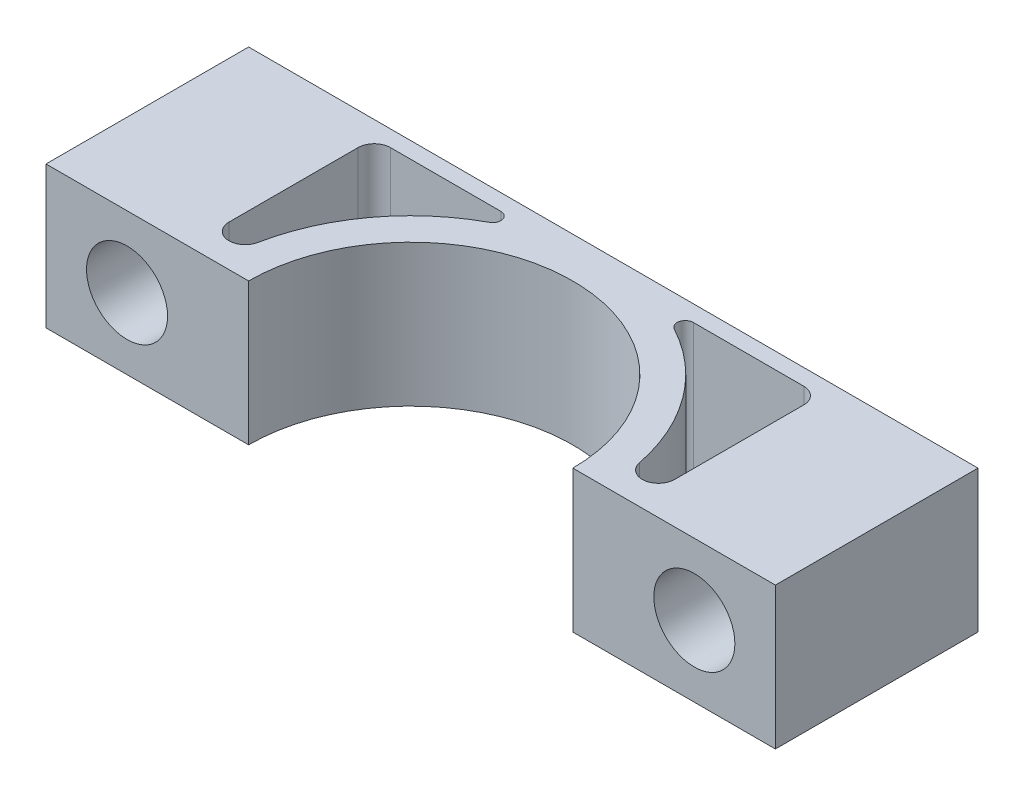
ISO-10303-21;
HEADER;
FILE_DESCRIPTION(('STEP AP214'),'2;1');
FILE_NAME('part.step','',(''),(''),'','','');
FILE_SCHEMA(('AUTOMOTIVE_DESIGN { 1 0 10303 214 1 1 1 1 }'));
ENDSEC;
DATA;
#1=APPLICATION_CONTEXT('core data for automotive mechanical design processes');
#2=APPLICATION_PROTOCOL_DEFINITION('international standard','automotive_design',2000,#1);
#3=PRODUCT_CONTEXT('',#1,'mechanical');
#4=PRODUCT('Part','Part','',(#3));
#5=PRODUCT_RELATED_PRODUCT_CATEGORY('part','',(#4));
#6=PRODUCT_DEFINITION_FORMATION('','',#4);
#7=PRODUCT_DEFINITION_CONTEXT('part definition',#1,'design');
#8=PRODUCT_DEFINITION('design','',#6,#7);
#9=PRODUCT_DEFINITION_SHAPE('','',#8);
#10=(LENGTH_UNIT() NAMED_UNIT(*) SI_UNIT(.MILLI.,.METRE.));
#11=(NAMED_UNIT(*) PLANE_ANGLE_UNIT() SI_UNIT($,.RADIAN.));
#12=(NAMED_UNIT(*) SI_UNIT($,.STERADIAN.) SOLID_ANGLE_UNIT());
#13=UNCERTAINTY_MEASURE_WITH_UNIT(LENGTH_MEASURE(1.E-05),#10,'distance_accuracy_value','');
#14=(GEOMETRIC_REPRESENTATION_CONTEXT(3) GLOBAL_UNCERTAINTY_ASSIGNED_CONTEXT((#13)) GLOBAL_UNIT_ASSIGNED_CONTEXT((#10,
#11,#12)) REPRESENTATION_CONTEXT('',''));
#15=CARTESIAN_POINT('',(0.,0.,0.));
#16=DIRECTION('',(0.,0.,1.));
#17=DIRECTION('',(1.,0.,0.));
#18=AXIS2_PLACEMENT_3D('',#15,#16,#17);
#19=CARTESIAN_POINT('',(0.,5.5626,0.));
#20=DIRECTION('',(0.,-1.,0.));
#21=DIRECTION('',(0.,0.,-1.));
#22=AXIS2_PLACEMENT_3D('',#19,#20,#21);
#23=PLANE('',#22);
#24=CARTESIAN_POINT('',(-16.1925,5.5626,-3.22227307191679));
#25=DIRECTION('',(0.,1.,0.));
#26=DIRECTION('',(0.,0.,1.));
#27=AXIS2_PLACEMENT_3D('',#24,#25,#26);
#28=CIRCLE('',#27,1.27);
#29=CARTESIAN_POINT('',(-17.4625,5.5626,-3.22227307191679));
#30=VERTEX_POINT('',#29);
#31=CARTESIAN_POINT('',(-14.9469230769231,5.5626,-2.97440591253857));
#32=VERTEX_POINT('',#31);
#33=EDGE_CURVE('E226',#30,#32,#28,.T.);
#34=ORIENTED_EDGE('',*,*,#33,.F.);
#35=DIRECTION('',(0.,0.,1.));
#36=VECTOR('',#35,1.);
#37=CARTESIAN_POINT('',(-17.4625,5.5626,-3.22227307191679));
#38=LINE('',#37,#36);
#39=CARTESIAN_POINT('',(-17.4625,5.5626,-13.335));
#40=VERTEX_POINT('',#39);
#41=EDGE_CURVE('E239',#40,#30,#38,.T.);
#42=ORIENTED_EDGE('',*,*,#41,.F.);
#43=CARTESIAN_POINT('',(-16.1925,5.5626,-13.335));
#44=DIRECTION('',(0.,1.,0.));
#45=DIRECTION('',(0.,0.,1.));
#46=AXIS2_PLACEMENT_3D('',#43,#44,#45);
#47=CIRCLE('',#46,1.27);
#48=CARTESIAN_POINT('',(-16.1925,5.5626,-14.605));
#49=VERTEX_POINT('',#48);
#50=EDGE_CURVE('E243',#49,#40,#47,.T.);
#51=ORIENTED_EDGE('',*,*,#50,.F.);
#52=DIRECTION('',(-1.,0.,0.));
#53=VECTOR('',#52,1.);
#54=CARTESIAN_POINT('',(-16.1925,5.5626,-14.605));
#55=LINE('',#54,#53);
#56=CARTESIAN_POINT('',(-7.54020722526908,5.5626,-14.605));
#57=VERTEX_POINT('',#56);
#58=EDGE_CURVE('E593',#57,#49,#55,.T.);
#59=ORIENTED_EDGE('',*,*,#58,.F.);
#60=CARTESIAN_POINT('',(-7.54020722526908,5.5626,-13.97));
#61=DIRECTION('',(0.,1.,0.));
#62=DIRECTION('',(0.,0.,1.));
#63=AXIS2_PLACEMENT_3D('',#60,#61,#62);
#64=CIRCLE('',#63,0.635);
#65=CARTESIAN_POINT('',(-7.23859893625831,5.5626,-13.4112));
#66=VERTEX_POINT('',#65);
#67=EDGE_CURVE('E600',#66,#57,#64,.T.);
#68=ORIENTED_EDGE('',*,*,#67,.F.);
#69=CARTESIAN_POINT('',(0.,5.5626,0.));
#70=DIRECTION('',(0.,-1.,0.));
#71=DIRECTION('',(0.,0.,-1.));
#72=AXIS2_PLACEMENT_3D('',#69,#70,#71);
#73=CIRCLE('',#72,15.24);
#74=EDGE_CURVE('E229',#32,#66,#73,.T.);
#75=ORIENTED_EDGE('',*,*,#74,.F.);
#76=EDGE_LOOP('',(#34,#42,#51,#59,#68,#75));
#77=FACE_BOUND('',#76,.T.);
#78=CARTESIAN_POINT('',(0.,5.5626,0.));
#79=DIRECTION('',(0.,-1.,0.));
#80=DIRECTION('',(0.,0.,-1.));
#81=AXIS2_PLACEMENT_3D('',#78,#79,#80);
#82=CIRCLE('',#81,12.7);
#83=CARTESIAN_POINT('',(-12.7,5.5626,0.));
#84=VERTEX_POINT('',#83);
#85=CARTESIAN_POINT('',(12.7,5.5626,0.));
#86=VERTEX_POINT('',#85);
#87=EDGE_CURVE('E276',#84,#86,#82,.T.);
#88=ORIENTED_EDGE('',*,*,#87,.T.);
#89=DIRECTION('',(1.,0.,0.));
#90=VECTOR('',#89,1.);
#91=CARTESIAN_POINT('',(28.575,5.5626,0.));
#92=LINE('',#91,#90);
#93=CARTESIAN_POINT('',(28.575,5.5626,0.));
#94=VERTEX_POINT('',#93);
#95=EDGE_CURVE('E280',#86,#94,#92,.T.);
#96=ORIENTED_EDGE('',*,*,#95,.T.);
#97=DIRECTION('',(0.,0.,-1.));
#98=VECTOR('',#97,1.);
#99=CARTESIAN_POINT('',(28.575,5.5626,-15.875));
#100=LINE('',#99,#98);
#101=CARTESIAN_POINT('',(28.575,5.5626,-15.875));
#102=VERTEX_POINT('',#101);
#103=EDGE_CURVE('E292',#94,#102,#100,.T.);
#104=ORIENTED_EDGE('',*,*,#103,.T.);
#105=DIRECTION('',(-1.,0.,0.));
#106=VECTOR('',#105,1.);
#107=CARTESIAN_POINT('',(-28.575,5.5626,-15.875));
#108=LINE('',#107,#106);
#109=CARTESIAN_POINT('',(-28.575,5.5626,-15.875));
#110=VERTEX_POINT('',#109);
#111=EDGE_CURVE('E294',#102,#110,#108,.T.);
#112=ORIENTED_EDGE('',*,*,#111,.T.);
#113=DIRECTION('',(0.,0.,1.));
#114=VECTOR('',#113,1.);
#115=CARTESIAN_POINT('',(-28.575,5.5626,0.));
#116=LINE('',#115,#114);
#117=CARTESIAN_POINT('',(-28.575,5.5626,0.));
#118=VERTEX_POINT('',#117);
#119=EDGE_CURVE('E297',#110,#118,#116,.T.);
#120=ORIENTED_EDGE('',*,*,#119,.T.);
#121=DIRECTION('',(1.,0.,0.));
#122=VECTOR('',#121,1.);
#123=CARTESIAN_POINT('',(-12.7,5.5626,0.));
#124=LINE('',#123,#122);
#125=EDGE_CURVE('E300',#118,#84,#124,.T.);
#126=ORIENTED_EDGE('',*,*,#125,.T.);
#127=EDGE_LOOP('',(#88,#96,#104,#112,#120,#126));
#128=FACE_BOUND('',#127,.T.);
#129=CARTESIAN_POINT('',(16.1925,5.5626,-13.335));
#130=DIRECTION('',(0.,1.,0.));
#131=DIRECTION('',(0.,0.,-1.));
#132=AXIS2_PLACEMENT_3D('',#129,#130,#131);
#133=CIRCLE('',#132,1.27);
#134=CARTESIAN_POINT('',(17.4625,5.5626,-13.335));
#135=VERTEX_POINT('',#134);
#136=CARTESIAN_POINT('',(16.1925,5.5626,-14.605));
#137=VERTEX_POINT('',#136);
#138=EDGE_CURVE('E164',#135,#137,#133,.T.);
#139=ORIENTED_EDGE('',*,*,#138,.F.);
#140=DIRECTION('',(0.,0.,-1.));
#141=VECTOR('',#140,1.);
#142=CARTESIAN_POINT('',(17.4625,5.5626,-3.22227307191679));
#143=LINE('',#142,#141);
#144=CARTESIAN_POINT('',(17.4625,5.5626,-3.22227307191679));
#145=VERTEX_POINT('',#144);
#146=EDGE_CURVE('E202',#145,#135,#143,.T.);
#147=ORIENTED_EDGE('',*,*,#146,.F.);
#148=CARTESIAN_POINT('',(16.1925,5.5626,-3.22227307191679));
#149=DIRECTION('',(0.,1.,0.));
#150=DIRECTION('',(0.,0.,-1.));
#151=AXIS2_PLACEMENT_3D('',#148,#149,#150);
#152=CIRCLE('',#151,1.27);
#153=CARTESIAN_POINT('',(14.9469230769231,5.5626,-2.97440591253858));
#154=VERTEX_POINT('',#153);
#155=EDGE_CURVE('E200',#154,#145,#152,.T.);
#156=ORIENTED_EDGE('',*,*,#155,.F.);
#157=CARTESIAN_POINT('',(0.,5.5626,0.));
#158=DIRECTION('',(0.,-1.,0.));
#159=DIRECTION('',(0.,0.,1.));
#160=AXIS2_PLACEMENT_3D('',#157,#158,#159);
#161=CIRCLE('',#160,15.24);
#162=CARTESIAN_POINT('',(7.23859893625831,5.5626,-13.4112));
#163=VERTEX_POINT('',#162);
#164=EDGE_CURVE('E186',#163,#154,#161,.T.);
#165=ORIENTED_EDGE('',*,*,#164,.F.);
#166=CARTESIAN_POINT('',(7.54020722526908,5.5626,-13.97));
#167=DIRECTION('',(0.,1.,0.));
#168=DIRECTION('',(0.,0.,-1.));
#169=AXIS2_PLACEMENT_3D('',#166,#167,#168);
#170=CIRCLE('',#169,0.635);
#171=CARTESIAN_POINT('',(7.54020722526908,5.5626,-14.605));
#172=VERTEX_POINT('',#171);
#173=EDGE_CURVE('E185',#172,#163,#170,.T.);
#174=ORIENTED_EDGE('',*,*,#173,.F.);
#175=DIRECTION('',(-1.,0.,0.));
#176=VECTOR('',#175,1.);
#177=CARTESIAN_POINT('',(16.1925,5.5626,-14.605));
#178=LINE('',#177,#176);
#179=EDGE_CURVE('E172',#137,#172,#178,.T.);
#180=ORIENTED_EDGE('',*,*,#179,.F.);
#181=EDGE_LOOP('',(#139,#147,#156,#165,#174,#180));
#182=FACE_BOUND('',#181,.T.);
#183=ADVANCED_FACE('F39',(#77,#128,#182),#23,.F.);
#184=CARTESIAN_POINT('',(0.,-5.5626,0.));
#185=DIRECTION('',(0.,-1.,0.));
#186=DIRECTION('',(0.,0.,-1.));
#187=AXIS2_PLACEMENT_3D('',#184,#185,#186);
#188=PLANE('',#187);
#189=CARTESIAN_POINT('',(0.,-5.5626,0.));
#190=DIRECTION('',(0.,-1.,0.));
#191=DIRECTION('',(0.,0.,-1.));
#192=AXIS2_PLACEMENT_3D('',#189,#190,#191);
#193=CIRCLE('',#192,12.7);
#194=CARTESIAN_POINT('',(-12.7,-5.5626,0.));
#195=VERTEX_POINT('',#194);
#196=CARTESIAN_POINT('',(12.7,-5.5626,0.));
#197=VERTEX_POINT('',#196);
#198=EDGE_CURVE('E275',#195,#197,#193,.T.);
#199=ORIENTED_EDGE('',*,*,#198,.F.);
#200=DIRECTION('',(1.,0.,0.));
#201=VECTOR('',#200,1.);
#202=CARTESIAN_POINT('',(-12.7,-5.5626,0.));
#203=LINE('',#202,#201);
#204=CARTESIAN_POINT('',(-28.575,-5.5626,0.));
#205=VERTEX_POINT('',#204);
#206=EDGE_CURVE('E281',#205,#195,#203,.T.);
#207=ORIENTED_EDGE('',*,*,#206,.F.);
#208=DIRECTION('',(0.,0.,1.));
#209=VECTOR('',#208,1.);
#210=CARTESIAN_POINT('',(-28.575,-5.5626,0.));
#211=LINE('',#210,#209);
#212=CARTESIAN_POINT('',(-28.575,-5.5626,-15.875));
#213=VERTEX_POINT('',#212);
#214=EDGE_CURVE('E313',#213,#205,#211,.T.);
#215=ORIENTED_EDGE('',*,*,#214,.F.);
#216=DIRECTION('',(-1.,0.,0.));
#217=VECTOR('',#216,1.);
#218=CARTESIAN_POINT('',(-28.575,-5.5626,-15.875));
#219=LINE('',#218,#217);
#220=CARTESIAN_POINT('',(28.575,-5.5626,-15.875));
#221=VERTEX_POINT('',#220);
#222=EDGE_CURVE('E311',#221,#213,#219,.T.);
#223=ORIENTED_EDGE('',*,*,#222,.F.);
#224=DIRECTION('',(0.,0.,-1.));
#225=VECTOR('',#224,1.);
#226=CARTESIAN_POINT('',(28.575,-5.5626,-15.875));
#227=LINE('',#226,#225);
#228=CARTESIAN_POINT('',(28.575,-5.5626,0.));
#229=VERTEX_POINT('',#228);
#230=EDGE_CURVE('E309',#229,#221,#227,.T.);
#231=ORIENTED_EDGE('',*,*,#230,.F.);
#232=DIRECTION('',(1.,0.,0.));
#233=VECTOR('',#232,1.);
#234=CARTESIAN_POINT('',(28.575,-5.5626,0.));
#235=LINE('',#234,#233);
#236=EDGE_CURVE('E307',#197,#229,#235,.T.);
#237=ORIENTED_EDGE('',*,*,#236,.F.);
#238=EDGE_LOOP('',(#199,#207,#215,#223,#231,#237));
#239=FACE_BOUND('',#238,.T.);
#240=DIRECTION('',(0.,0.,1.));
#241=VECTOR('',#240,1.);
#242=CARTESIAN_POINT('',(-17.4625,-5.5626,-3.22227307191679));
#243=LINE('',#242,#241);
#244=CARTESIAN_POINT('',(-17.4625,-5.5626,-13.335));
#245=VERTEX_POINT('',#244);
#246=CARTESIAN_POINT('',(-17.4625,-5.5626,-3.22227307191679));
#247=VERTEX_POINT('',#246);
#248=EDGE_CURVE('E230',#245,#247,#243,.T.);
#249=ORIENTED_EDGE('',*,*,#248,.T.);
#250=CARTESIAN_POINT('',(-16.1925,-5.5626,-3.22227307191679));
#251=DIRECTION('',(0.,1.,0.));
#252=DIRECTION('',(0.,0.,1.));
#253=AXIS2_PLACEMENT_3D('',#250,#251,#252);
#254=CIRCLE('',#253,1.27);
#255=CARTESIAN_POINT('',(-14.9469230769231,-5.5626,-2.97440591253857));
#256=VERTEX_POINT('',#255);
#257=EDGE_CURVE('E180',#247,#256,#254,.T.);
#258=ORIENTED_EDGE('',*,*,#257,.T.);
#259=CARTESIAN_POINT('',(0.,-5.5626,0.));
#260=DIRECTION('',(0.,-1.,0.));
#261=DIRECTION('',(0.,0.,-1.));
#262=AXIS2_PLACEMENT_3D('',#259,#260,#261);
#263=CIRCLE('',#262,15.24);
#264=CARTESIAN_POINT('',(-7.23859893625831,-5.5626,-13.4112));
#265=VERTEX_POINT('',#264);
#266=EDGE_CURVE('E248',#256,#265,#263,.T.);
#267=ORIENTED_EDGE('',*,*,#266,.T.);
#268=CARTESIAN_POINT('',(-7.54020722526908,-5.5626,-13.97));
#269=DIRECTION('',(0.,1.,0.));
#270=DIRECTION('',(0.,0.,1.));
#271=AXIS2_PLACEMENT_3D('',#268,#269,#270);
#272=CIRCLE('',#271,0.635);
#273=CARTESIAN_POINT('',(-7.54020722526908,-5.5626,-14.605));
#274=VERTEX_POINT('',#273);
#275=EDGE_CURVE('E251',#265,#274,#272,.T.);
#276=ORIENTED_EDGE('',*,*,#275,.T.);
#277=DIRECTION('',(-1.,0.,0.));
#278=VECTOR('',#277,1.);
#279=CARTESIAN_POINT('',(-16.1925,-5.5626,-14.605));
#280=LINE('',#279,#278);
#281=CARTESIAN_POINT('',(-16.1925,-5.5626,-14.605));
#282=VERTEX_POINT('',#281);
#283=EDGE_CURVE('E254',#274,#282,#280,.T.);
#284=ORIENTED_EDGE('',*,*,#283,.T.);
#285=CARTESIAN_POINT('',(-16.1925,-5.5626,-13.335));
#286=DIRECTION('',(0.,1.,0.));
#287=DIRECTION('',(0.,0.,1.));
#288=AXIS2_PLACEMENT_3D('',#285,#286,#287);
#289=CIRCLE('',#288,1.27);
#290=EDGE_CURVE('E257',#282,#245,#289,.T.);
#291=ORIENTED_EDGE('',*,*,#290,.T.);
#292=EDGE_LOOP('',(#249,#258,#267,#276,#284,#291));
#293=FACE_BOUND('',#292,.T.);
#294=DIRECTION('',(0.,0.,-1.));
#295=VECTOR('',#294,1.);
#296=CARTESIAN_POINT('',(17.4625,-5.5626,-3.22227307191679));
#297=LINE('',#296,#295);
#298=CARTESIAN_POINT('',(17.4625,-5.5626,-3.22227307191679));
#299=VERTEX_POINT('',#298);
#300=CARTESIAN_POINT('',(17.4625,-5.5626,-13.335));
#301=VERTEX_POINT('',#300);
#302=EDGE_CURVE('E173',#299,#301,#297,.T.);
#303=ORIENTED_EDGE('',*,*,#302,.T.);
#304=CARTESIAN_POINT('',(16.1925,-5.5626,-13.335));
#305=DIRECTION('',(0.,1.,0.));
#306=DIRECTION('',(0.,0.,-1.));
#307=AXIS2_PLACEMENT_3D('',#304,#305,#306);
#308=CIRCLE('',#307,1.27);
#309=CARTESIAN_POINT('',(16.1925,-5.5626,-14.605));
#310=VERTEX_POINT('',#309);
#311=EDGE_CURVE('E62',#301,#310,#308,.T.);
#312=ORIENTED_EDGE('',*,*,#311,.T.);
#313=DIRECTION('',(-1.,0.,0.));
#314=VECTOR('',#313,1.);
#315=CARTESIAN_POINT('',(16.1925,-5.5626,-14.605));
#316=LINE('',#315,#314);
#317=CARTESIAN_POINT('',(7.54020722526908,-5.5626,-14.605));
#318=VERTEX_POINT('',#317);
#319=EDGE_CURVE('E179',#310,#318,#316,.T.);
#320=ORIENTED_EDGE('',*,*,#319,.T.);
#321=CARTESIAN_POINT('',(7.54020722526908,-5.5626,-13.97));
#322=DIRECTION('',(0.,1.,0.));
#323=DIRECTION('',(0.,0.,-1.));
#324=AXIS2_PLACEMENT_3D('',#321,#322,#323);
#325=CIRCLE('',#324,0.635);
#326=CARTESIAN_POINT('',(7.23859893625831,-5.5626,-13.4112));
#327=VERTEX_POINT('',#326);
#328=EDGE_CURVE('E208',#318,#327,#325,.T.);
#329=ORIENTED_EDGE('',*,*,#328,.T.);
#330=CARTESIAN_POINT('',(0.,-5.5626,0.));
#331=DIRECTION('',(0.,-1.,0.));
#332=DIRECTION('',(0.,0.,1.));
#333=AXIS2_PLACEMENT_3D('',#330,#331,#332);
#334=CIRCLE('',#333,15.24);
#335=CARTESIAN_POINT('',(14.9469230769231,-5.5626,-2.97440591253858));
#336=VERTEX_POINT('',#335);
#337=EDGE_CURVE('E211',#327,#336,#334,.T.);
#338=ORIENTED_EDGE('',*,*,#337,.T.);
#339=CARTESIAN_POINT('',(16.1925,-5.5626,-3.22227307191679));
#340=DIRECTION('',(0.,1.,0.));
#341=DIRECTION('',(0.,0.,-1.));
#342=AXIS2_PLACEMENT_3D('',#339,#340,#341);
#343=CIRCLE('',#342,1.27);
#344=EDGE_CURVE('E214',#336,#299,#343,.T.);
#345=ORIENTED_EDGE('',*,*,#344,.T.);
#346=EDGE_LOOP('',(#303,#312,#320,#329,#338,#345));
#347=FACE_BOUND('',#346,.T.);
#348=ADVANCED_FACE('F337',(#239,#293,#347),#188,.T.);
#349=CARTESIAN_POINT('',(0.,5.5626,0.));
#350=DIRECTION('',(0.,-1.,0.));
#351=DIRECTION('',(0.,0.,-1.));
#352=AXIS2_PLACEMENT_3D('',#349,#350,#351);
#353=CYLINDRICAL_SURFACE('',#352,12.7);
#354=ORIENTED_EDGE('',*,*,#198,.T.);
#355=DIRECTION('',(0.,-1.,0.));
#356=VECTOR('',#355,1.);
#357=CARTESIAN_POINT('',(12.7,5.5626,0.));
#358=LINE('',#357,#356);
#359=EDGE_CURVE('E12',#86,#197,#358,.T.);
#360=ORIENTED_EDGE('',*,*,#359,.F.);
#361=ORIENTED_EDGE('',*,*,#87,.F.);
#362=DIRECTION('',(0.,-1.,0.));
#363=VECTOR('',#362,1.);
#364=CARTESIAN_POINT('',(-12.7,5.5626,0.));
#365=LINE('',#364,#363);
#366=EDGE_CURVE('E304',#84,#195,#365,.T.);
#367=ORIENTED_EDGE('',*,*,#366,.T.);
#368=EDGE_LOOP('',(#354,#360,#361,#367));
#369=FACE_BOUND('',#368,.T.);
#370=ADVANCED_FACE('F41',(#369),#353,.F.);
#371=CARTESIAN_POINT('',(28.575,5.5626,0.));
#372=DIRECTION('',(0.,0.,-1.));
#373=DIRECTION('',(-1.,0.,0.));
#374=AXIS2_PLACEMENT_3D('',#371,#372,#373);
#375=PLANE('',#374);
#376=CARTESIAN_POINT('',(22.225,0.,0.));
#377=DIRECTION('',(0.,0.,1.));
#378=DIRECTION('',(1.,0.,0.));
#379=AXIS2_PLACEMENT_3D('',#376,#377,#378);
#380=CIRCLE('',#379,3.175);
#381=CARTESIAN_POINT('',(25.4,0.,0.));
#382=VERTEX_POINT('',#381);
#383=EDGE_CURVE('E436',#382,#382,#380,.T.);
#384=ORIENTED_EDGE('',*,*,#383,.F.);
#385=EDGE_LOOP('',(#384));
#386=FACE_BOUND('',#385,.T.);
#387=ORIENTED_EDGE('',*,*,#236,.T.);
#388=DIRECTION('',(0.,-1.,0.));
#389=VECTOR('',#388,1.);
#390=CARTESIAN_POINT('',(28.575,5.5626,0.));
#391=LINE('',#390,#389);
#392=EDGE_CURVE('E47',#94,#229,#391,.T.);
#393=ORIENTED_EDGE('',*,*,#392,.F.);
#394=ORIENTED_EDGE('',*,*,#95,.F.);
#395=ORIENTED_EDGE('',*,*,#359,.T.);
#396=EDGE_LOOP('',(#387,#393,#394,#395));
#397=FACE_BOUND('',#396,.T.);
#398=ADVANCED_FACE('F354',(#386,#397),#375,.F.);
#399=CARTESIAN_POINT('',(28.575,5.5626,-15.875));
#400=DIRECTION('',(-1.,0.,0.));
#401=DIRECTION('',(0.,0.,1.));
#402=AXIS2_PLACEMENT_3D('',#399,#400,#401);
#403=PLANE('',#402);
#404=ORIENTED_EDGE('',*,*,#230,.T.);
#405=DIRECTION('',(0.,-1.,0.));
#406=VECTOR('',#405,1.);
#407=CARTESIAN_POINT('',(28.575,5.5626,-15.875));
#408=LINE('',#407,#406);
#409=EDGE_CURVE('E324',#102,#221,#408,.T.);
#410=ORIENTED_EDGE('',*,*,#409,.F.);
#411=ORIENTED_EDGE('',*,*,#103,.F.);
#412=ORIENTED_EDGE('',*,*,#392,.T.);
#413=EDGE_LOOP('',(#404,#410,#411,#412));
#414=FACE_BOUND('',#413,.T.);
#415=ADVANCED_FACE('F331',(#414),#403,.F.);
#416=CARTESIAN_POINT('',(-28.575,5.5626,-15.875));
#417=DIRECTION('',(0.,0.,1.));
#418=DIRECTION('',(1.,0.,0.));
#419=AXIS2_PLACEMENT_3D('',#416,#417,#418);
#420=PLANE('',#419);
#421=CARTESIAN_POINT('',(-22.225,0.,-15.875));
#422=DIRECTION('',(0.,0.,1.));
#423=DIRECTION('',(1.,0.,0.));
#424=AXIS2_PLACEMENT_3D('',#421,#422,#423);
#425=CIRCLE('',#424,3.175);
#426=CARTESIAN_POINT('',(-19.05,0.,-15.875));
#427=VERTEX_POINT('',#426);
#428=EDGE_CURVE('E206',#427,#427,#425,.T.);
#429=ORIENTED_EDGE('',*,*,#428,.T.);
#430=EDGE_LOOP('',(#429));
#431=FACE_BOUND('',#430,.T.);
#432=CARTESIAN_POINT('',(22.225,0.,-15.875));
#433=DIRECTION('',(0.,0.,1.));
#434=DIRECTION('',(1.,0.,0.));
#435=AXIS2_PLACEMENT_3D('',#432,#433,#434);
#436=CIRCLE('',#435,3.175);
#437=CARTESIAN_POINT('',(25.4,0.,-15.875));
#438=VERTEX_POINT('',#437);
#439=EDGE_CURVE('E432',#438,#438,#436,.T.);
#440=ORIENTED_EDGE('',*,*,#439,.T.);
#441=EDGE_LOOP('',(#440));
#442=FACE_BOUND('',#441,.T.);
#443=ORIENTED_EDGE('',*,*,#222,.T.);
#444=DIRECTION('',(0.,-1.,0.));
#445=VECTOR('',#444,1.);
#446=CARTESIAN_POINT('',(-28.575,5.5626,-15.875));
#447=LINE('',#446,#445);
#448=EDGE_CURVE('E321',#110,#213,#447,.T.);
#449=ORIENTED_EDGE('',*,*,#448,.F.);
#450=ORIENTED_EDGE('',*,*,#111,.F.);
#451=ORIENTED_EDGE('',*,*,#409,.T.);
#452=EDGE_LOOP('',(#443,#449,#450,#451));
#453=FACE_BOUND('',#452,.T.);
#454=ADVANCED_FACE('F343',(#431,#442,#453),#420,.F.);
#455=CARTESIAN_POINT('',(-28.575,5.5626,0.));
#456=DIRECTION('',(1.,0.,0.));
#457=DIRECTION('',(0.,0.,-1.));
#458=AXIS2_PLACEMENT_3D('',#455,#456,#457);
#459=PLANE('',#458);
#460=ORIENTED_EDGE('',*,*,#214,.T.);
#461=DIRECTION('',(0.,-1.,0.));
#462=VECTOR('',#461,1.);
#463=CARTESIAN_POINT('',(-28.575,5.5626,0.));
#464=LINE('',#463,#462);
#465=EDGE_CURVE('E318',#118,#205,#464,.T.);
#466=ORIENTED_EDGE('',*,*,#465,.F.);
#467=ORIENTED_EDGE('',*,*,#119,.F.);
#468=ORIENTED_EDGE('',*,*,#448,.T.);
#469=EDGE_LOOP('',(#460,#466,#467,#468));
#470=FACE_BOUND('',#469,.T.);
#471=ADVANCED_FACE('F347',(#470),#459,.F.);
#472=CARTESIAN_POINT('',(-12.7,5.5626,0.));
#473=DIRECTION('',(0.,0.,-1.));
#474=DIRECTION('',(-1.,0.,0.));
#475=AXIS2_PLACEMENT_3D('',#472,#473,#474);
#476=PLANE('',#475);
#477=CARTESIAN_POINT('',(-22.225,0.,0.));
#478=DIRECTION('',(0.,0.,1.));
#479=DIRECTION('',(1.,0.,0.));
#480=AXIS2_PLACEMENT_3D('',#477,#478,#479);
#481=CIRCLE('',#480,3.175);
#482=CARTESIAN_POINT('',(-19.05,0.,0.));
#483=VERTEX_POINT('',#482);
#484=EDGE_CURVE('E431',#483,#483,#481,.T.);
#485=ORIENTED_EDGE('',*,*,#484,.F.);
#486=EDGE_LOOP('',(#485));
#487=FACE_BOUND('',#486,.T.);
#488=ORIENTED_EDGE('',*,*,#206,.T.);
#489=ORIENTED_EDGE('',*,*,#366,.F.);
#490=ORIENTED_EDGE('',*,*,#125,.F.);
#491=ORIENTED_EDGE('',*,*,#465,.T.);
#492=EDGE_LOOP('',(#488,#489,#490,#491));
#493=FACE_BOUND('',#492,.T.);
#494=ADVANCED_FACE('F357',(#487,#493),#476,.F.);
#495=CARTESIAN_POINT('',(-16.1925,5.5626,-3.22227307191679));
#496=DIRECTION('',(0.,-1.,0.));
#497=DIRECTION('',(0.,0.,-1.));
#498=AXIS2_PLACEMENT_3D('',#495,#496,#497);
#499=CYLINDRICAL_SURFACE('',#498,1.27);
#500=ORIENTED_EDGE('',*,*,#257,.F.);
#501=DIRECTION('',(0.,-1.,0.));
#502=VECTOR('',#501,1.);
#503=CARTESIAN_POINT('',(-17.4625,5.5626,-3.22227307191679));
#504=LINE('',#503,#502);
#505=EDGE_CURVE('E242',#30,#247,#504,.T.);
#506=ORIENTED_EDGE('',*,*,#505,.F.);
#507=ORIENTED_EDGE('',*,*,#33,.T.);
#508=DIRECTION('',(0.,-1.,0.));
#509=VECTOR('',#508,1.);
#510=CARTESIAN_POINT('',(-14.9469230769231,5.5626,-2.97440591253857));
#511=LINE('',#510,#509);
#512=EDGE_CURVE('E272',#32,#256,#511,.T.);
#513=ORIENTED_EDGE('',*,*,#512,.T.);
#514=EDGE_LOOP('',(#500,#506,#507,#513));
#515=FACE_BOUND('',#514,.T.);
#516=ADVANCED_FACE('F359',(#515),#499,.F.);
#517=CARTESIAN_POINT('',(0.,5.5626,0.));
#518=DIRECTION('',(0.,-1.,0.));
#519=DIRECTION('',(0.,0.,-1.));
#520=AXIS2_PLACEMENT_3D('',#517,#518,#519);
#521=CYLINDRICAL_SURFACE('',#520,15.24);
#522=ORIENTED_EDGE('',*,*,#266,.F.);
#523=ORIENTED_EDGE('',*,*,#512,.F.);
#524=ORIENTED_EDGE('',*,*,#74,.T.);
#525=DIRECTION('',(0.,-1.,0.));
#526=VECTOR('',#525,1.);
#527=CARTESIAN_POINT('',(-7.23859893625831,5.5626,-13.4112));
#528=LINE('',#527,#526);
#529=EDGE_CURVE('E270',#66,#265,#528,.T.);
#530=ORIENTED_EDGE('',*,*,#529,.T.);
#531=EDGE_LOOP('',(#522,#523,#524,#530));
#532=FACE_BOUND('',#531,.T.);
#533=ADVANCED_FACE('F366',(#532),#521,.T.);
#534=CARTESIAN_POINT('',(-7.54020722526908,5.5626,-13.97));
#535=DIRECTION('',(0.,-1.,0.));
#536=DIRECTION('',(0.,0.,-1.));
#537=AXIS2_PLACEMENT_3D('',#534,#535,#536);
#538=CYLINDRICAL_SURFACE('',#537,0.635);
#539=ORIENTED_EDGE('',*,*,#275,.F.);
#540=ORIENTED_EDGE('',*,*,#529,.F.);
#541=ORIENTED_EDGE('',*,*,#67,.T.);
#542=DIRECTION('',(0.,-1.,0.));
#543=VECTOR('',#542,1.);
#544=CARTESIAN_POINT('',(-7.54020722526908,5.5626,-14.605));
#545=LINE('',#544,#543);
#546=EDGE_CURVE('E268',#57,#274,#545,.T.);
#547=ORIENTED_EDGE('',*,*,#546,.T.);
#548=EDGE_LOOP('',(#539,#540,#541,#547));
#549=FACE_BOUND('',#548,.T.);
#550=ADVANCED_FACE('F382',(#549),#538,.F.);
#551=CARTESIAN_POINT('',(-16.1925,5.5626,-14.605));
#552=DIRECTION('',(0.,0.,1.));
#553=DIRECTION('',(1.,0.,0.));
#554=AXIS2_PLACEMENT_3D('',#551,#552,#553);
#555=PLANE('',#554);
#556=ORIENTED_EDGE('',*,*,#283,.F.);
#557=ORIENTED_EDGE('',*,*,#546,.F.);
#558=ORIENTED_EDGE('',*,*,#58,.T.);
#559=DIRECTION('',(0.,-1.,0.));
#560=VECTOR('',#559,1.);
#561=CARTESIAN_POINT('',(-16.1925,5.5626,-14.605));
#562=LINE('',#561,#560);
#563=EDGE_CURVE('E266',#49,#282,#562,.T.);
#564=ORIENTED_EDGE('',*,*,#563,.T.);
#565=EDGE_LOOP('',(#556,#557,#558,#564));
#566=FACE_BOUND('',#565,.T.);
#567=ADVANCED_FACE('F386',(#566),#555,.T.);
#568=CARTESIAN_POINT('',(-16.1925,5.5626,-13.335));
#569=DIRECTION('',(0.,-1.,0.));
#570=DIRECTION('',(0.,0.,-1.));
#571=AXIS2_PLACEMENT_3D('',#568,#569,#570);
#572=CYLINDRICAL_SURFACE('',#571,1.27);
#573=ORIENTED_EDGE('',*,*,#290,.F.);
#574=ORIENTED_EDGE('',*,*,#563,.F.);
#575=ORIENTED_EDGE('',*,*,#50,.T.);
#576=DIRECTION('',(0.,-1.,0.));
#577=VECTOR('',#576,1.);
#578=CARTESIAN_POINT('',(-17.4625,5.5626,-13.335));
#579=LINE('',#578,#577);
#580=EDGE_CURVE('E264',#40,#245,#579,.T.);
#581=ORIENTED_EDGE('',*,*,#580,.T.);
#582=EDGE_LOOP('',(#573,#574,#575,#581));
#583=FACE_BOUND('',#582,.T.);
#584=ADVANCED_FACE('F390',(#583),#572,.F.);
#585=CARTESIAN_POINT('',(-17.4625,5.5626,-3.22227307191679));
#586=DIRECTION('',(1.,0.,0.));
#587=DIRECTION('',(0.,0.,-1.));
#588=AXIS2_PLACEMENT_3D('',#585,#586,#587);
#589=PLANE('',#588);
#590=ORIENTED_EDGE('',*,*,#248,.F.);
#591=ORIENTED_EDGE('',*,*,#580,.F.);
#592=ORIENTED_EDGE('',*,*,#41,.T.);
#593=ORIENTED_EDGE('',*,*,#505,.T.);
#594=EDGE_LOOP('',(#590,#591,#592,#593));
#595=FACE_BOUND('',#594,.T.);
#596=ADVANCED_FACE('F394',(#595),#589,.T.);
#597=CARTESIAN_POINT('',(16.1925,5.5626,-13.335));
#598=DIRECTION('',(0.,-1.,0.));
#599=DIRECTION('',(0.,0.,-1.));
#600=AXIS2_PLACEMENT_3D('',#597,#598,#599);
#601=CYLINDRICAL_SURFACE('',#600,1.27);
#602=ORIENTED_EDGE('',*,*,#311,.F.);
#603=DIRECTION('',(0.,-1.,0.));
#604=VECTOR('',#603,1.);
#605=CARTESIAN_POINT('',(17.4625,5.5626,-13.335));
#606=LINE('',#605,#604);
#607=EDGE_CURVE('E168',#135,#301,#606,.T.);
#608=ORIENTED_EDGE('',*,*,#607,.F.);
#609=ORIENTED_EDGE('',*,*,#138,.T.);
#610=DIRECTION('',(0.,-1.,0.));
#611=VECTOR('',#610,1.);
#612=CARTESIAN_POINT('',(16.1925,5.5626,-14.605));
#613=LINE('',#612,#611);
#614=EDGE_CURVE('E167',#137,#310,#613,.T.);
#615=ORIENTED_EDGE('',*,*,#614,.T.);
#616=EDGE_LOOP('',(#602,#608,#609,#615));
#617=FACE_BOUND('',#616,.T.);
#618=ADVANCED_FACE('F166',(#617),#601,.F.);
#619=CARTESIAN_POINT('',(16.1925,5.5626,-14.605));
#620=DIRECTION('',(0.,0.,1.));
#621=DIRECTION('',(1.,0.,0.));
#622=AXIS2_PLACEMENT_3D('',#619,#620,#621);
#623=PLANE('',#622);
#624=ORIENTED_EDGE('',*,*,#319,.F.);
#625=ORIENTED_EDGE('',*,*,#614,.F.);
#626=ORIENTED_EDGE('',*,*,#179,.T.);
#627=DIRECTION('',(0.,-1.,0.));
#628=VECTOR('',#627,1.);
#629=CARTESIAN_POINT('',(7.54020722526908,5.5626,-14.605));
#630=LINE('',#629,#628);
#631=EDGE_CURVE('E181',#172,#318,#630,.T.);
#632=ORIENTED_EDGE('',*,*,#631,.T.);
#633=EDGE_LOOP('',(#624,#625,#626,#632));
#634=FACE_BOUND('',#633,.T.);
#635=ADVANCED_FACE('F176',(#634),#623,.T.);
#636=CARTESIAN_POINT('',(7.54020722526908,5.5626,-13.97));
#637=DIRECTION('',(0.,-1.,0.));
#638=DIRECTION('',(0.,0.,-1.));
#639=AXIS2_PLACEMENT_3D('',#636,#637,#638);
#640=CYLINDRICAL_SURFACE('',#639,0.635);
#641=ORIENTED_EDGE('',*,*,#328,.F.);
#642=ORIENTED_EDGE('',*,*,#631,.F.);
#643=ORIENTED_EDGE('',*,*,#173,.T.);
#644=DIRECTION('',(0.,-1.,0.));
#645=VECTOR('',#644,1.);
#646=CARTESIAN_POINT('',(7.23859893625831,5.5626,-13.4112));
#647=LINE('',#646,#645);
#648=EDGE_CURVE('E223',#163,#327,#647,.T.);
#649=ORIENTED_EDGE('',*,*,#648,.T.);
#650=EDGE_LOOP('',(#641,#642,#643,#649));
#651=FACE_BOUND('',#650,.T.);
#652=ADVANCED_FACE('F403',(#651),#640,.F.);
#653=CARTESIAN_POINT('',(0.,5.5626,0.));
#654=DIRECTION('',(0.,-1.,0.));
#655=DIRECTION('',(0.,0.,-1.));
#656=AXIS2_PLACEMENT_3D('',#653,#654,#655);
#657=CYLINDRICAL_SURFACE('',#656,15.24);
#658=ORIENTED_EDGE('',*,*,#337,.F.);
#659=ORIENTED_EDGE('',*,*,#648,.F.);
#660=ORIENTED_EDGE('',*,*,#164,.T.);
#661=DIRECTION('',(0.,-1.,0.));
#662=VECTOR('',#661,1.);
#663=CARTESIAN_POINT('',(14.9469230769231,5.5626,-2.97440591253858));
#664=LINE('',#663,#662);
#665=EDGE_CURVE('E221',#154,#336,#664,.T.);
#666=ORIENTED_EDGE('',*,*,#665,.T.);
#667=EDGE_LOOP('',(#658,#659,#660,#666));
#668=FACE_BOUND('',#667,.T.);
#669=ADVANCED_FACE('F406',(#668),#657,.T.);
#670=CARTESIAN_POINT('',(16.1925,5.5626,-3.22227307191679));
#671=DIRECTION('',(0.,-1.,0.));
#672=DIRECTION('',(0.,0.,-1.));
#673=AXIS2_PLACEMENT_3D('',#670,#671,#672);
#674=CYLINDRICAL_SURFACE('',#673,1.27);
#675=ORIENTED_EDGE('',*,*,#344,.F.);
#676=ORIENTED_EDGE('',*,*,#665,.F.);
#677=ORIENTED_EDGE('',*,*,#155,.T.);
#678=DIRECTION('',(0.,-1.,0.));
#679=VECTOR('',#678,1.);
#680=CARTESIAN_POINT('',(17.4625,5.5626,-3.22227307191679));
#681=LINE('',#680,#679);
#682=EDGE_CURVE('E54',#145,#299,#681,.T.);
#683=ORIENTED_EDGE('',*,*,#682,.T.);
#684=EDGE_LOOP('',(#675,#676,#677,#683));
#685=FACE_BOUND('',#684,.T.);
#686=ADVANCED_FACE('F410',(#685),#674,.F.);
#687=CARTESIAN_POINT('',(17.4625,5.5626,-3.22227307191679));
#688=DIRECTION('',(-1.,0.,0.));
#689=DIRECTION('',(0.,0.,1.));
#690=AXIS2_PLACEMENT_3D('',#687,#688,#689);
#691=PLANE('',#690);
#692=ORIENTED_EDGE('',*,*,#302,.F.);
#693=ORIENTED_EDGE('',*,*,#682,.F.);
#694=ORIENTED_EDGE('',*,*,#146,.T.);
#695=ORIENTED_EDGE('',*,*,#607,.T.);
#696=EDGE_LOOP('',(#692,#693,#694,#695));
#697=FACE_BOUND('',#696,.T.);
#698=ADVANCED_FACE('F414',(#697),#691,.T.);
#699=CARTESIAN_POINT('',(-22.225,0.,-15.875));
#700=DIRECTION('',(0.,0.,1.));
#701=DIRECTION('',(1.,0.,0.));
#702=AXIS2_PLACEMENT_3D('',#699,#700,#701);
#703=CYLINDRICAL_SURFACE('',#702,3.175);
#704=ORIENTED_EDGE('',*,*,#428,.F.);
#705=EDGE_LOOP('',(#704));
#706=FACE_BOUND('',#705,.T.);
#707=ORIENTED_EDGE('',*,*,#484,.T.);
#708=EDGE_LOOP('',(#707));
#709=FACE_BOUND('',#708,.T.);
#710=ADVANCED_FACE('F418',(#706,#709),#703,.F.);
#711=CARTESIAN_POINT('',(22.225,0.,-15.875));
#712=DIRECTION('',(0.,0.,1.));
#713=DIRECTION('',(1.,0.,0.));
#714=AXIS2_PLACEMENT_3D('',#711,#712,#713);
#715=CYLINDRICAL_SURFACE('',#714,3.175);
#716=ORIENTED_EDGE('',*,*,#439,.F.);
#717=EDGE_LOOP('',(#716));
#718=FACE_BOUND('',#717,.T.);
#719=ORIENTED_EDGE('',*,*,#383,.T.);
#720=EDGE_LOOP('',(#719));
#721=FACE_BOUND('',#720,.T.);
#722=ADVANCED_FACE('F419',(#718,#721),#715,.F.);
#723=CLOSED_SHELL('',(#183,#348,#370,#398,#415,#454,#471,#494,#516,#533,#550,#567,#584,#596,
#618,#635,#652,#669,#686,#698,#710,#722));
#724=MANIFOLD_SOLID_BREP('B2',#723);
#725=ADVANCED_BREP_SHAPE_REPRESENTATION('',(#18,#724),#14);
#726=SHAPE_DEFINITION_REPRESENTATION(#9,#725);
ENDSEC;
END-ISO-10303-21;
